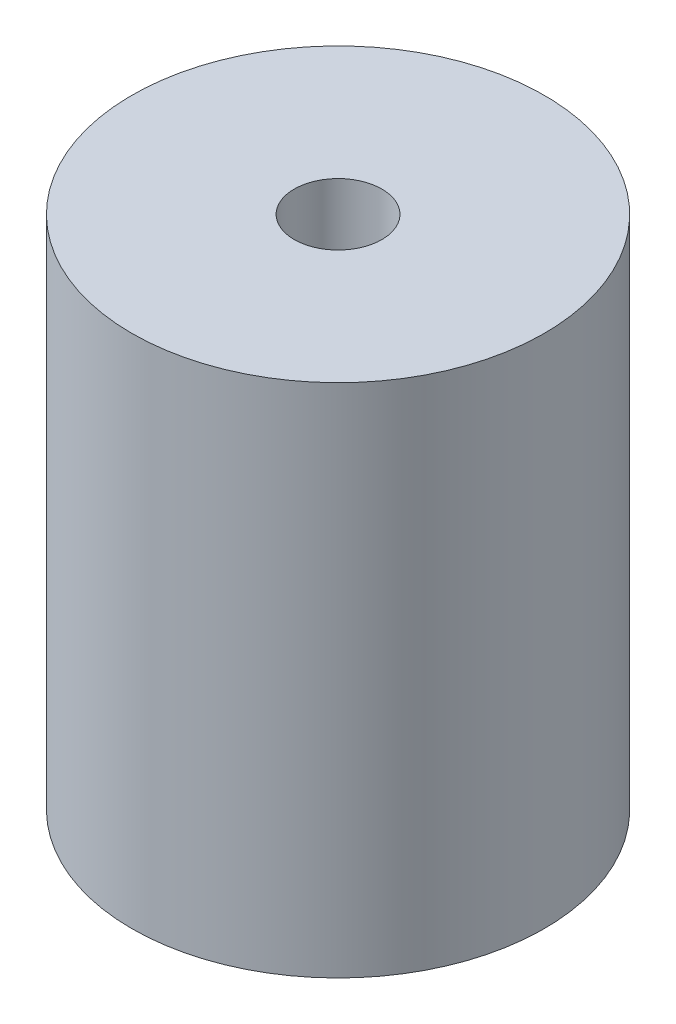
ISO-10303-21;
HEADER;
FILE_DESCRIPTION(('STEP AP214'),'2;1');
FILE_NAME('part.step','',(''),(''),'','','');
FILE_SCHEMA(('AUTOMOTIVE_DESIGN { 1 0 10303 214 1 1 1 1 }'));
ENDSEC;
DATA;
#1=APPLICATION_CONTEXT('core data for automotive mechanical design processes');
#2=APPLICATION_PROTOCOL_DEFINITION('international standard','automotive_design',2000,#1);
#3=PRODUCT_CONTEXT('',#1,'mechanical');
#4=PRODUCT('Part','Part','',(#3));
#5=PRODUCT_RELATED_PRODUCT_CATEGORY('part','',(#4));
#6=PRODUCT_DEFINITION_FORMATION('','',#4);
#7=PRODUCT_DEFINITION_CONTEXT('part definition',#1,'design');
#8=PRODUCT_DEFINITION('design','',#6,#7);
#9=PRODUCT_DEFINITION_SHAPE('','',#8);
#10=(LENGTH_UNIT() NAMED_UNIT(*) SI_UNIT(.MILLI.,.METRE.));
#11=(NAMED_UNIT(*) PLANE_ANGLE_UNIT() SI_UNIT($,.RADIAN.));
#12=(NAMED_UNIT(*) SI_UNIT($,.STERADIAN.) SOLID_ANGLE_UNIT());
#13=UNCERTAINTY_MEASURE_WITH_UNIT(LENGTH_MEASURE(1.E-05),#10,'distance_accuracy_value','');
#14=(GEOMETRIC_REPRESENTATION_CONTEXT(3) GLOBAL_UNCERTAINTY_ASSIGNED_CONTEXT((#13)) GLOBAL_UNIT_ASSIGNED_CONTEXT((#10,
#11,#12)) REPRESENTATION_CONTEXT('',''));
#15=CARTESIAN_POINT('',(0.,0.,0.));
#16=DIRECTION('',(0.,0.,1.));
#17=DIRECTION('',(1.,0.,0.));
#18=AXIS2_PLACEMENT_3D('',#15,#16,#17);
#19=CARTESIAN_POINT('',(0.,20.,0.));
#20=DIRECTION('',(0.,1.,0.));
#21=DIRECTION('',(0.,0.,1.));
#22=AXIS2_PLACEMENT_3D('',#19,#20,#21);
#23=PLANE('',#22);
#24=CARTESIAN_POINT('',(0.,20.,0.));
#25=DIRECTION('',(0.,1.,0.));
#26=DIRECTION('',(0.,0.,1.));
#27=AXIS2_PLACEMENT_3D('',#24,#25,#26);
#28=CIRCLE('',#27,8.);
#29=CARTESIAN_POINT('',(0.,20.,8.));
#30=VERTEX_POINT('',#29);
#31=EDGE_CURVE('E10',#30,#30,#28,.T.);
#32=ORIENTED_EDGE('',*,*,#31,.T.);
#33=EDGE_LOOP('',(#32));
#34=FACE_BOUND('',#33,.T.);
#35=CARTESIAN_POINT('',(0.,20.,0.));
#36=DIRECTION('',(0.,1.,0.));
#37=DIRECTION('',(0.,0.,1.));
#38=AXIS2_PLACEMENT_3D('',#35,#36,#37);
#39=CIRCLE('',#38,1.7);
#40=CARTESIAN_POINT('',(0.,20.,1.7));
#41=VERTEX_POINT('',#40);
#42=EDGE_CURVE('E57',#41,#41,#39,.T.);
#43=ORIENTED_EDGE('',*,*,#42,.F.);
#44=EDGE_LOOP('',(#43));
#45=FACE_BOUND('',#44,.T.);
#46=ADVANCED_FACE('F43',(#34,#45),#23,.T.);
#47=CARTESIAN_POINT('',(0.,0.,0.));
#48=DIRECTION('',(0.,1.,0.));
#49=DIRECTION('',(0.,0.,1.));
#50=AXIS2_PLACEMENT_3D('',#47,#48,#49);
#51=PLANE('',#50);
#52=CARTESIAN_POINT('',(0.,0.,0.));
#53=DIRECTION('',(0.,1.,0.));
#54=DIRECTION('',(0.,0.,1.));
#55=AXIS2_PLACEMENT_3D('',#52,#53,#54);
#56=CIRCLE('',#55,8.);
#57=CARTESIAN_POINT('',(0.,0.,8.));
#58=VERTEX_POINT('',#57);
#59=EDGE_CURVE('E50',#58,#58,#56,.T.);
#60=ORIENTED_EDGE('',*,*,#59,.F.);
#61=EDGE_LOOP('',(#60));
#62=FACE_BOUND('',#61,.T.);
#63=CARTESIAN_POINT('',(0.,0.,0.));
#64=DIRECTION('',(0.,1.,0.));
#65=DIRECTION('',(0.,0.,1.));
#66=AXIS2_PLACEMENT_3D('',#63,#64,#65);
#67=CIRCLE('',#66,1.7);
#68=CARTESIAN_POINT('',(0.,0.,1.7));
#69=VERTEX_POINT('',#68);
#70=EDGE_CURVE('E59',#69,#69,#67,.T.);
#71=ORIENTED_EDGE('',*,*,#70,.T.);
#72=EDGE_LOOP('',(#71));
#73=FACE_BOUND('',#72,.T.);
#74=ADVANCED_FACE('F66',(#62,#73),#51,.F.);
#75=CARTESIAN_POINT('',(0.,20.,0.));
#76=DIRECTION('',(0.,-1.,0.));
#77=DIRECTION('',(0.,0.,-1.));
#78=AXIS2_PLACEMENT_3D('',#75,#76,#77);
#79=CYLINDRICAL_SURFACE('',#78,8.);
#80=ORIENTED_EDGE('',*,*,#31,.F.);
#81=EDGE_LOOP('',(#80));
#82=FACE_BOUND('',#81,.T.);
#83=ORIENTED_EDGE('',*,*,#59,.T.);
#84=EDGE_LOOP('',(#83));
#85=FACE_BOUND('',#84,.T.);
#86=ADVANCED_FACE('F44',(#82,#85),#79,.T.);
#87=CARTESIAN_POINT('',(0.,20.,0.));
#88=DIRECTION('',(0.,-1.,0.));
#89=DIRECTION('',(0.,0.,-1.));
#90=AXIS2_PLACEMENT_3D('',#87,#88,#89);
#91=CYLINDRICAL_SURFACE('',#90,1.7);
#92=ORIENTED_EDGE('',*,*,#42,.T.);
#93=EDGE_LOOP('',(#92));
#94=FACE_BOUND('',#93,.T.);
#95=ORIENTED_EDGE('',*,*,#70,.F.);
#96=EDGE_LOOP('',(#95));
#97=FACE_BOUND('',#96,.T.);
#98=ADVANCED_FACE('F68',(#94,#97),#91,.F.);
#99=CLOSED_SHELL('',(#46,#74,#86,#98));
#100=MANIFOLD_SOLID_BREP('B2',#99);
#101=ADVANCED_BREP_SHAPE_REPRESENTATION('',(#18,#100),#14);
#102=SHAPE_DEFINITION_REPRESENTATION(#9,#101);
ENDSEC;
END-ISO-10303-21;
